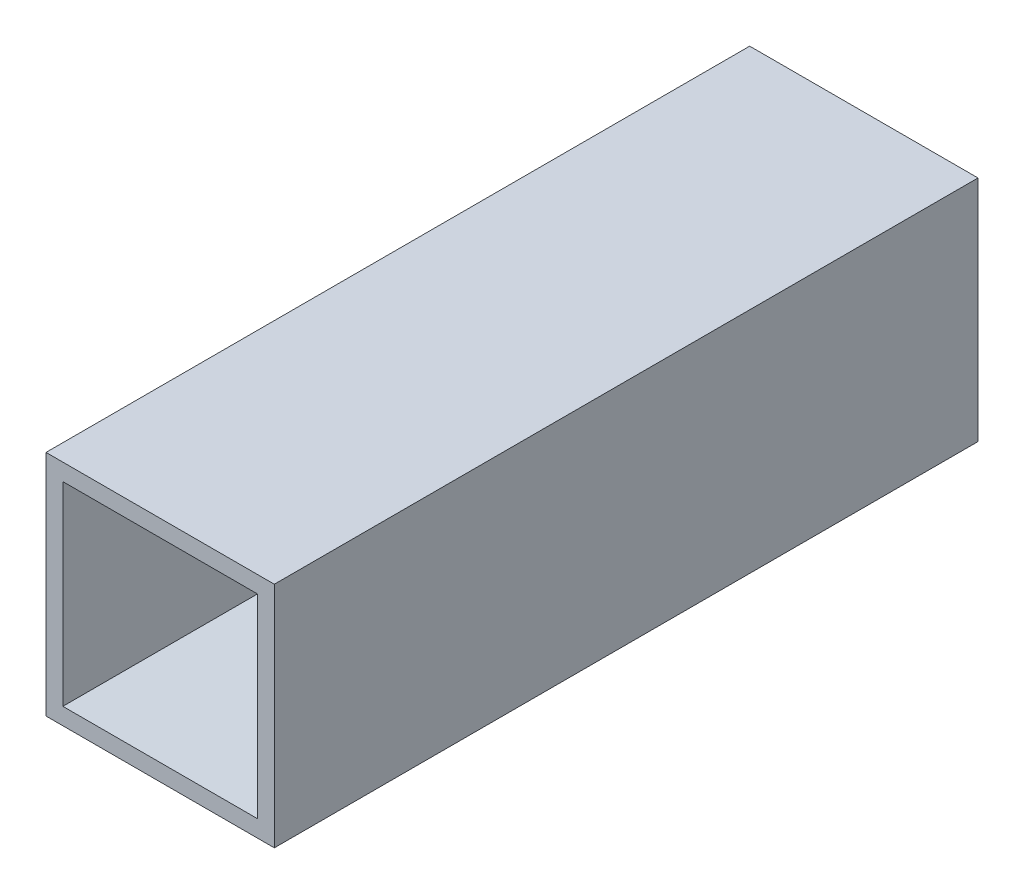
ISO-10303-21;
HEADER;
FILE_DESCRIPTION(('STEP AP214'),'2;1');
FILE_NAME('part.step','',(''),(''),'','','');
FILE_SCHEMA(('AUTOMOTIVE_DESIGN { 1 0 10303 214 1 1 1 1 }'));
ENDSEC;
DATA;
#1=APPLICATION_CONTEXT('core data for automotive mechanical design processes');
#2=APPLICATION_PROTOCOL_DEFINITION('international standard','automotive_design',2000,#1);
#3=PRODUCT_CONTEXT('',#1,'mechanical');
#4=PRODUCT('Part','Part','',(#3));
#5=PRODUCT_RELATED_PRODUCT_CATEGORY('part','',(#4));
#6=PRODUCT_DEFINITION_FORMATION('','',#4);
#7=PRODUCT_DEFINITION_CONTEXT('part definition',#1,'design');
#8=PRODUCT_DEFINITION('design','',#6,#7);
#9=PRODUCT_DEFINITION_SHAPE('','',#8);
#10=(LENGTH_UNIT() NAMED_UNIT(*) SI_UNIT(.MILLI.,.METRE.));
#11=(NAMED_UNIT(*) PLANE_ANGLE_UNIT() SI_UNIT($,.RADIAN.));
#12=(NAMED_UNIT(*) SI_UNIT($,.STERADIAN.) SOLID_ANGLE_UNIT());
#13=UNCERTAINTY_MEASURE_WITH_UNIT(LENGTH_MEASURE(1.E-05),#10,'distance_accuracy_value','');
#14=(GEOMETRIC_REPRESENTATION_CONTEXT(3) GLOBAL_UNCERTAINTY_ASSIGNED_CONTEXT((#13)) GLOBAL_UNIT_ASSIGNED_CONTEXT((#10,
#11,#12)) REPRESENTATION_CONTEXT('',''));
#15=CARTESIAN_POINT('',(0.,0.,0.));
#16=DIRECTION('',(0.,0.,1.));
#17=DIRECTION('',(1.,0.,0.));
#18=AXIS2_PLACEMENT_3D('',#15,#16,#17);
#19=CARTESIAN_POINT('',(0.,0.,874.));
#20=DIRECTION('',(0.,0.,-1.));
#21=DIRECTION('',(-1.,0.,0.));
#22=AXIS2_PLACEMENT_3D('',#19,#20,#21);
#23=PLANE('',#22);
#24=DIRECTION('',(0.,-1.,0.));
#25=VECTOR('',#24,1.);
#26=CARTESIAN_POINT('',(0.,0.,874.));
#27=LINE('',#26,#25);
#28=CARTESIAN_POINT('',(0.,305.,874.));
#29=VERTEX_POINT('',#28);
#30=CARTESIAN_POINT('',(0.,0.,874.));
#31=VERTEX_POINT('',#30);
#32=EDGE_CURVE('E194',#29,#31,#27,.T.);
#33=ORIENTED_EDGE('',*,*,#32,.T.);
#34=DIRECTION('',(1.,0.,0.));
#35=VECTOR('',#34,1.);
#36=CARTESIAN_POINT('',(0.,0.,874.));
#37=LINE('',#36,#35);
#38=CARTESIAN_POINT('',(305.,0.,874.));
#39=VERTEX_POINT('',#38);
#40=EDGE_CURVE('E197',#31,#39,#37,.T.);
#41=ORIENTED_EDGE('',*,*,#40,.T.);
#42=DIRECTION('',(0.,1.,0.));
#43=VECTOR('',#42,1.);
#44=CARTESIAN_POINT('',(305.,0.,874.));
#45=LINE('',#44,#43);
#46=CARTESIAN_POINT('',(305.,305.,874.));
#47=VERTEX_POINT('',#46);
#48=EDGE_CURVE('E133',#39,#47,#45,.T.);
#49=ORIENTED_EDGE('',*,*,#48,.T.);
#50=DIRECTION('',(-1.,0.,0.));
#51=VECTOR('',#50,1.);
#52=CARTESIAN_POINT('',(0.,305.,874.));
#53=LINE('',#52,#51);
#54=EDGE_CURVE('E200',#47,#29,#53,.T.);
#55=ORIENTED_EDGE('',*,*,#54,.T.);
#56=EDGE_LOOP('',(#33,#41,#49,#55));
#57=FACE_BOUND('',#56,.T.);
#58=DIRECTION('',(-1.,0.,0.));
#59=VECTOR('',#58,1.);
#60=CARTESIAN_POINT('',(22.5,282.5,874.));
#61=LINE('',#60,#59);
#62=CARTESIAN_POINT('',(282.5,282.5,874.));
#63=VERTEX_POINT('',#62);
#64=CARTESIAN_POINT('',(22.5,282.5,874.));
#65=VERTEX_POINT('',#64);
#66=EDGE_CURVE('E169',#63,#65,#61,.T.);
#67=ORIENTED_EDGE('',*,*,#66,.F.);
#68=DIRECTION('',(0.,1.,0.));
#69=VECTOR('',#68,1.);
#70=CARTESIAN_POINT('',(282.5,282.5,874.));
#71=LINE('',#70,#69);
#72=CARTESIAN_POINT('',(282.5,22.5,874.));
#73=VERTEX_POINT('',#72);
#74=EDGE_CURVE('E226',#73,#63,#71,.T.);
#75=ORIENTED_EDGE('',*,*,#74,.F.);
#76=DIRECTION('',(1.,0.,0.));
#77=VECTOR('',#76,1.);
#78=CARTESIAN_POINT('',(22.5,22.5,874.));
#79=LINE('',#78,#77);
#80=CARTESIAN_POINT('',(22.5,22.5,874.));
#81=VERTEX_POINT('',#80);
#82=EDGE_CURVE('E223',#81,#73,#79,.T.);
#83=ORIENTED_EDGE('',*,*,#82,.F.);
#84=DIRECTION('',(0.,-1.,0.));
#85=VECTOR('',#84,1.);
#86=CARTESIAN_POINT('',(22.5,282.5,874.));
#87=LINE('',#86,#85);
#88=EDGE_CURVE('E57',#65,#81,#87,.T.);
#89=ORIENTED_EDGE('',*,*,#88,.F.);
#90=EDGE_LOOP('',(#67,#75,#83,#89));
#91=FACE_BOUND('',#90,.T.);
#92=ADVANCED_FACE('F40',(#57,#91),#23,.F.);
#93=CARTESIAN_POINT('',(0.,0.,874.));
#94=DIRECTION('',(1.,0.,0.));
#95=DIRECTION('',(0.,0.,-1.));
#96=AXIS2_PLACEMENT_3D('',#93,#94,#95);
#97=PLANE('',#96);
#98=DIRECTION('',(0.,0.,-1.));
#99=VECTOR('',#98,1.);
#100=CARTESIAN_POINT('',(0.,305.,874.));
#101=LINE('',#100,#99);
#102=CARTESIAN_POINT('',(0.,305.,-66.));
#103=VERTEX_POINT('',#102);
#104=EDGE_CURVE('E202',#29,#103,#101,.T.);
#105=ORIENTED_EDGE('',*,*,#104,.T.);
#106=DIRECTION('',(0.,1.,0.));
#107=VECTOR('',#106,1.);
#108=CARTESIAN_POINT('',(0.,305.,-66.));
#109=LINE('',#108,#107);
#110=CARTESIAN_POINT('',(0.,0.,-66.));
#111=VERTEX_POINT('',#110);
#112=EDGE_CURVE('E144',#111,#103,#109,.T.);
#113=ORIENTED_EDGE('',*,*,#112,.F.);
#114=DIRECTION('',(0.,0.,-1.));
#115=VECTOR('',#114,1.);
#116=CARTESIAN_POINT('',(0.,0.,874.));
#117=LINE('',#116,#115);
#118=EDGE_CURVE('E12',#31,#111,#117,.T.);
#119=ORIENTED_EDGE('',*,*,#118,.F.);
#120=ORIENTED_EDGE('',*,*,#32,.F.);
#121=EDGE_LOOP('',(#105,#113,#119,#120));
#122=FACE_BOUND('',#121,.T.);
#123=DIRECTION('',(0.,1.,0.));
#124=VECTOR('',#123,1.);
#125=CARTESIAN_POINT('',(0.,202.5,824.));
#126=LINE('',#125,#124);
#127=CARTESIAN_POINT('',(0.,102.5,824.));
#128=VERTEX_POINT('',#127);
#129=CARTESIAN_POINT('',(0.,202.5,824.));
#130=VERTEX_POINT('',#129);
#131=EDGE_CURVE('E175',#128,#130,#126,.T.);
#132=ORIENTED_EDGE('',*,*,#131,.F.);
#133=DIRECTION('',(0.,0.,1.));
#134=VECTOR('',#133,1.);
#135=CARTESIAN_POINT('',(0.,102.5,824.));
#136=LINE('',#135,#134);
#137=CARTESIAN_POINT('',(0.,102.5,724.));
#138=VERTEX_POINT('',#137);
#139=EDGE_CURVE('E182',#138,#128,#136,.T.);
#140=ORIENTED_EDGE('',*,*,#139,.F.);
#141=DIRECTION('',(0.,-1.,0.));
#142=VECTOR('',#141,1.);
#143=CARTESIAN_POINT('',(0.,202.5,724.));
#144=LINE('',#143,#142);
#145=CARTESIAN_POINT('',(0.,202.5,724.));
#146=VERTEX_POINT('',#145);
#147=EDGE_CURVE('E65',#146,#138,#144,.T.);
#148=ORIENTED_EDGE('',*,*,#147,.F.);
#149=DIRECTION('',(0.,0.,-1.));
#150=VECTOR('',#149,1.);
#151=CARTESIAN_POINT('',(0.,202.5,824.));
#152=LINE('',#151,#150);
#153=EDGE_CURVE('E184',#130,#146,#152,.T.);
#154=ORIENTED_EDGE('',*,*,#153,.F.);
#155=EDGE_LOOP('',(#132,#140,#148,#154));
#156=FACE_BOUND('',#155,.T.);
#157=ADVANCED_FACE('F42',(#122,#156),#97,.F.);
#158=CARTESIAN_POINT('',(0.,0.,874.));
#159=DIRECTION('',(0.,1.,0.));
#160=DIRECTION('',(0.,0.,1.));
#161=AXIS2_PLACEMENT_3D('',#158,#159,#160);
#162=PLANE('',#161);
#163=ORIENTED_EDGE('',*,*,#118,.T.);
#164=DIRECTION('',(-1.,0.,0.));
#165=VECTOR('',#164,1.);
#166=CARTESIAN_POINT('',(0.,0.,-66.));
#167=LINE('',#166,#165);
#168=CARTESIAN_POINT('',(305.,0.,-66.));
#169=VERTEX_POINT('',#168);
#170=EDGE_CURVE('E138',#169,#111,#167,.T.);
#171=ORIENTED_EDGE('',*,*,#170,.F.);
#172=DIRECTION('',(0.,0.,-1.));
#173=VECTOR('',#172,1.);
#174=CARTESIAN_POINT('',(305.,0.,874.));
#175=LINE('',#174,#173);
#176=EDGE_CURVE('E49',#39,#169,#175,.T.);
#177=ORIENTED_EDGE('',*,*,#176,.F.);
#178=ORIENTED_EDGE('',*,*,#40,.F.);
#179=EDGE_LOOP('',(#163,#171,#177,#178));
#180=FACE_BOUND('',#179,.T.);
#181=ADVANCED_FACE('F139',(#180),#162,.F.);
#182=CARTESIAN_POINT('',(305.,0.,874.));
#183=DIRECTION('',(-1.,0.,0.));
#184=DIRECTION('',(0.,0.,1.));
#185=AXIS2_PLACEMENT_3D('',#182,#183,#184);
#186=PLANE('',#185);
#187=ORIENTED_EDGE('',*,*,#176,.T.);
#188=DIRECTION('',(0.,-1.,0.));
#189=VECTOR('',#188,1.);
#190=CARTESIAN_POINT('',(305.,0.,-66.));
#191=LINE('',#190,#189);
#192=CARTESIAN_POINT('',(305.,305.,-66.));
#193=VERTEX_POINT('',#192);
#194=EDGE_CURVE('E132',#193,#169,#191,.T.);
#195=ORIENTED_EDGE('',*,*,#194,.F.);
#196=DIRECTION('',(0.,0.,-1.));
#197=VECTOR('',#196,1.);
#198=CARTESIAN_POINT('',(305.,305.,874.));
#199=LINE('',#198,#197);
#200=EDGE_CURVE('E135',#47,#193,#199,.T.);
#201=ORIENTED_EDGE('',*,*,#200,.F.);
#202=ORIENTED_EDGE('',*,*,#48,.F.);
#203=EDGE_LOOP('',(#187,#195,#201,#202));
#204=FACE_BOUND('',#203,.T.);
#205=ADVANCED_FACE('F129',(#204),#186,.F.);
#206=CARTESIAN_POINT('',(0.,305.,874.));
#207=DIRECTION('',(0.,-1.,0.));
#208=DIRECTION('',(0.,0.,-1.));
#209=AXIS2_PLACEMENT_3D('',#206,#207,#208);
#210=PLANE('',#209);
#211=ORIENTED_EDGE('',*,*,#200,.T.);
#212=DIRECTION('',(1.,0.,0.));
#213=VECTOR('',#212,1.);
#214=CARTESIAN_POINT('',(305.,305.,-66.));
#215=LINE('',#214,#213);
#216=EDGE_CURVE('E149',#103,#193,#215,.T.);
#217=ORIENTED_EDGE('',*,*,#216,.F.);
#218=ORIENTED_EDGE('',*,*,#104,.F.);
#219=ORIENTED_EDGE('',*,*,#54,.F.);
#220=EDGE_LOOP('',(#211,#217,#218,#219));
#221=FACE_BOUND('',#220,.T.);
#222=ADVANCED_FACE('F271',(#221),#210,.F.);
#223=CARTESIAN_POINT('',(-100.,202.5,824.));
#224=DIRECTION('',(0.,-1.,0.));
#225=DIRECTION('',(0.,0.,-1.));
#226=AXIS2_PLACEMENT_3D('',#223,#224,#225);
#227=PLANE('',#226);
#228=DIRECTION('',(1.,0.,0.));
#229=VECTOR('',#228,1.);
#230=CARTESIAN_POINT('',(-100.,202.5,724.));
#231=LINE('',#230,#229);
#232=CARTESIAN_POINT('',(-100.,202.5,724.));
#233=VERTEX_POINT('',#232);
#234=EDGE_CURVE('E191',#233,#146,#231,.T.);
#235=ORIENTED_EDGE('',*,*,#234,.F.);
#236=DIRECTION('',(0.707106781186548,0.,0.707106781186547));
#237=VECTOR('',#236,1.);
#238=CARTESIAN_POINT('',(0.,202.5,824.));
#239=LINE('',#238,#237);
#240=EDGE_CURVE('E172',#233,#130,#239,.T.);
#241=ORIENTED_EDGE('',*,*,#240,.T.);
#242=ORIENTED_EDGE('',*,*,#153,.T.);
#243=EDGE_LOOP('',(#235,#241,#242));
#244=FACE_BOUND('',#243,.T.);
#245=ADVANCED_FACE('F269',(#244),#227,.F.);
#246=CARTESIAN_POINT('',(-100.,202.5,724.));
#247=DIRECTION('',(0.,0.,1.));
#248=DIRECTION('',(1.,0.,0.));
#249=AXIS2_PLACEMENT_3D('',#246,#247,#248);
#250=PLANE('',#249);
#251=ORIENTED_EDGE('',*,*,#147,.T.);
#252=DIRECTION('',(1.,0.,0.));
#253=VECTOR('',#252,1.);
#254=CARTESIAN_POINT('',(-100.,102.5,724.));
#255=LINE('',#254,#253);
#256=CARTESIAN_POINT('',(-100.,102.5,724.));
#257=VERTEX_POINT('',#256);
#258=EDGE_CURVE('E181',#257,#138,#255,.T.);
#259=ORIENTED_EDGE('',*,*,#258,.F.);
#260=DIRECTION('',(0.,-1.,0.));
#261=VECTOR('',#260,1.);
#262=CARTESIAN_POINT('',(-100.,202.5,724.));
#263=LINE('',#262,#261);
#264=EDGE_CURVE('E179',#233,#257,#263,.T.);
#265=ORIENTED_EDGE('',*,*,#264,.F.);
#266=ORIENTED_EDGE('',*,*,#234,.T.);
#267=EDGE_LOOP('',(#251,#259,#265,#266));
#268=FACE_BOUND('',#267,.T.);
#269=ADVANCED_FACE('F296',(#268),#250,.F.);
#270=CARTESIAN_POINT('',(-100.,102.5,824.));
#271=DIRECTION('',(0.,1.,0.));
#272=DIRECTION('',(0.,0.,1.));
#273=AXIS2_PLACEMENT_3D('',#270,#271,#272);
#274=PLANE('',#273);
#275=ORIENTED_EDGE('',*,*,#139,.T.);
#276=DIRECTION('',(0.707106781186548,0.,0.707106781186547));
#277=VECTOR('',#276,1.);
#278=CARTESIAN_POINT('',(0.,102.5,824.));
#279=LINE('',#278,#277);
#280=EDGE_CURVE('E176',#257,#128,#279,.T.);
#281=ORIENTED_EDGE('',*,*,#280,.F.);
#282=ORIENTED_EDGE('',*,*,#258,.T.);
#283=EDGE_LOOP('',(#275,#281,#282));
#284=FACE_BOUND('',#283,.T.);
#285=ADVANCED_FACE('F303',(#284),#274,.F.);
#286=CARTESIAN_POINT('',(0.,202.5,824.));
#287=DIRECTION('',(0.707106781186547,0.,-0.707106781186548));
#288=DIRECTION('',(-0.707106781186548,0.,-0.707106781186547));
#289=AXIS2_PLACEMENT_3D('',#286,#287,#288);
#290=PLANE('',#289);
#291=ORIENTED_EDGE('',*,*,#280,.T.);
#292=ORIENTED_EDGE('',*,*,#131,.T.);
#293=ORIENTED_EDGE('',*,*,#240,.F.);
#294=ORIENTED_EDGE('',*,*,#264,.T.);
#295=EDGE_LOOP('',(#291,#292,#293,#294));
#296=FACE_BOUND('',#295,.T.);
#297=ADVANCED_FACE('F258',(#296),#290,.F.);
#298=CARTESIAN_POINT('',(0.,241.993125845879,-11.075200267546));
#299=DIRECTION('',(0.,-0.998954351961386,0.0457187346435418));
#300=DIRECTION('',(0.,-0.0457187346435418,-0.998954351961386));
#301=AXIS2_PLACEMENT_3D('',#298,#299,#300);
#302=PLANE('',#301);
#303=DIRECTION('',(-0.045671028705602,0.045671028705602,0.997911977217402));
#304=VECTOR('',#303,1.);
#305=CARTESIAN_POINT('',(62.5,242.5,0.));
#306=LINE('',#305,#304);
#307=CARTESIAN_POINT('',(62.5,242.5,0.));
#308=VERTEX_POINT('',#307);
#309=EDGE_CURVE('E154',#308,#65,#306,.T.);
#310=ORIENTED_EDGE('',*,*,#309,.F.);
#311=DIRECTION('',(1.,0.,0.));
#312=VECTOR('',#311,1.);
#313=CARTESIAN_POINT('',(242.5,242.5,0.));
#314=LINE('',#313,#312);
#315=CARTESIAN_POINT('',(242.5,242.5,0.));
#316=VERTEX_POINT('',#315);
#317=EDGE_CURVE('E178',#308,#316,#314,.T.);
#318=ORIENTED_EDGE('',*,*,#317,.T.);
#319=DIRECTION('',(0.0456710287056019,0.0456710287056019,0.997911977217402));
#320=VECTOR('',#319,1.);
#321=CARTESIAN_POINT('',(242.5,242.5,0.));
#322=LINE('',#321,#320);
#323=EDGE_CURVE('E156',#316,#63,#322,.T.);
#324=ORIENTED_EDGE('',*,*,#323,.T.);
#325=ORIENTED_EDGE('',*,*,#66,.T.);
#326=EDGE_LOOP('',(#310,#318,#324,#325));
#327=FACE_BOUND('',#326,.T.);
#328=ADVANCED_FACE('F238',(#327),#302,.T.);
#329=CARTESIAN_POINT('',(241.993125845879,1.0333320773658E-13,-11.075200267546));
#330=DIRECTION('',(-0.998954351961386,0.,0.0457187346435417));
#331=DIRECTION('',(0.0457187346435417,0.,0.998954351961386));
#332=AXIS2_PLACEMENT_3D('',#329,#330,#331);
#333=PLANE('',#332);
#334=ORIENTED_EDGE('',*,*,#323,.F.);
#335=DIRECTION('',(0.,-1.,0.));
#336=VECTOR('',#335,1.);
#337=CARTESIAN_POINT('',(242.5,242.5,0.));
#338=LINE('',#337,#336);
#339=CARTESIAN_POINT('',(242.5,62.5,0.));
#340=VERTEX_POINT('',#339);
#341=EDGE_CURVE('E161',#316,#340,#338,.T.);
#342=ORIENTED_EDGE('',*,*,#341,.T.);
#343=DIRECTION('',(0.0456710287056021,-0.0456710287056019,0.997911977217402));
#344=VECTOR('',#343,1.);
#345=CARTESIAN_POINT('',(242.5,62.5,0.));
#346=LINE('',#345,#344);
#347=EDGE_CURVE('E165',#340,#73,#346,.T.);
#348=ORIENTED_EDGE('',*,*,#347,.T.);
#349=ORIENTED_EDGE('',*,*,#74,.T.);
#350=EDGE_LOOP('',(#334,#342,#348,#349));
#351=FACE_BOUND('',#350,.T.);
#352=ADVANCED_FACE('F250',(#351),#333,.T.);
#353=CARTESIAN_POINT('',(62.3693623314121,0.,2.85443305864586));
#354=DIRECTION('',(0.998954351961386,0.,0.0457187346435417));
#355=DIRECTION('',(0.0457187346435417,0.,-0.998954351961386));
#356=AXIS2_PLACEMENT_3D('',#353,#354,#355);
#357=PLANE('',#356);
#358=DIRECTION('',(-0.0456710287056019,-0.045671028705602,0.997911977217402));
#359=VECTOR('',#358,1.);
#360=CARTESIAN_POINT('',(62.5,62.5,0.));
#361=LINE('',#360,#359);
#362=CARTESIAN_POINT('',(62.5,62.5000000000001,0.));
#363=VERTEX_POINT('',#362);
#364=EDGE_CURVE('E157',#363,#81,#361,.T.);
#365=ORIENTED_EDGE('',*,*,#364,.F.);
#366=DIRECTION('',(0.,1.,0.));
#367=VECTOR('',#366,1.);
#368=CARTESIAN_POINT('',(62.5,242.5,0.));
#369=LINE('',#368,#367);
#370=EDGE_CURVE('E208',#363,#308,#369,.T.);
#371=ORIENTED_EDGE('',*,*,#370,.T.);
#372=ORIENTED_EDGE('',*,*,#309,.T.);
#373=ORIENTED_EDGE('',*,*,#88,.T.);
#374=EDGE_LOOP('',(#365,#371,#372,#373));
#375=FACE_BOUND('',#374,.T.);
#376=ADVANCED_FACE('F242',(#375),#357,.T.);
#377=CARTESIAN_POINT('',(0.,62.3693623314121,2.85443305864586));
#378=DIRECTION('',(0.,0.998954351961386,0.0457187346435418));
#379=DIRECTION('',(0.,-0.0457187346435418,0.998954351961386));
#380=AXIS2_PLACEMENT_3D('',#377,#378,#379);
#381=PLANE('',#380);
#382=ORIENTED_EDGE('',*,*,#347,.F.);
#383=DIRECTION('',(-1.,0.,0.));
#384=VECTOR('',#383,1.);
#385=CARTESIAN_POINT('',(242.5,62.5,0.));
#386=LINE('',#385,#384);
#387=EDGE_CURVE('E205',#340,#363,#386,.T.);
#388=ORIENTED_EDGE('',*,*,#387,.T.);
#389=ORIENTED_EDGE('',*,*,#364,.T.);
#390=ORIENTED_EDGE('',*,*,#82,.T.);
#391=EDGE_LOOP('',(#382,#388,#389,#390));
#392=FACE_BOUND('',#391,.T.);
#393=ADVANCED_FACE('F246',(#392),#381,.T.);
#394=CARTESIAN_POINT('',(0.,0.,0.));
#395=DIRECTION('',(0.,0.,1.));
#396=DIRECTION('',(1.,0.,0.));
#397=AXIS2_PLACEMENT_3D('',#394,#395,#396);
#398=PLANE('',#397);
#399=ORIENTED_EDGE('',*,*,#341,.F.);
#400=ORIENTED_EDGE('',*,*,#317,.F.);
#401=ORIENTED_EDGE('',*,*,#370,.F.);
#402=ORIENTED_EDGE('',*,*,#387,.F.);
#403=EDGE_LOOP('',(#399,#400,#401,#402));
#404=FACE_BOUND('',#403,.T.);
#405=ADVANCED_FACE('F248',(#404),#398,.T.);
#406=CARTESIAN_POINT('',(0.,0.,-66.));
#407=DIRECTION('',(0.,0.,1.));
#408=DIRECTION('',(1.,0.,0.));
#409=AXIS2_PLACEMENT_3D('',#406,#407,#408);
#410=PLANE('',#409);
#411=ORIENTED_EDGE('',*,*,#194,.T.);
#412=ORIENTED_EDGE('',*,*,#170,.T.);
#413=ORIENTED_EDGE('',*,*,#112,.T.);
#414=ORIENTED_EDGE('',*,*,#216,.T.);
#415=EDGE_LOOP('',(#411,#412,#413,#414));
#416=FACE_BOUND('',#415,.T.);
#417=ADVANCED_FACE('F147',(#416),#410,.F.);
#418=CLOSED_SHELL('',(#92,#157,#181,#205,#222,#245,#269,#285,#297,#328,#352,#376,#393,#405,#417));
#419=MANIFOLD_SOLID_BREP('B2',#418);
#420=ADVANCED_BREP_SHAPE_REPRESENTATION('',(#18,#419),#14);
#421=SHAPE_DEFINITION_REPRESENTATION(#9,#420);
ENDSEC;
END-ISO-10303-21;
